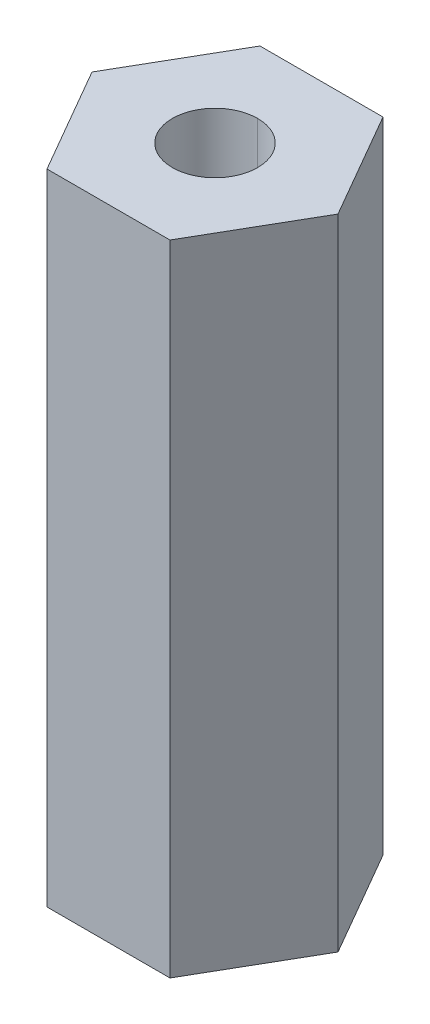
ISO-10303-21;
HEADER;
FILE_DESCRIPTION(('STEP AP214'),'2;1');
FILE_NAME('part.step','',(''),(''),'','','');
FILE_SCHEMA(('AUTOMOTIVE_DESIGN { 1 0 10303 214 1 1 1 1 }'));
ENDSEC;
DATA;
#1=APPLICATION_CONTEXT('core data for automotive mechanical design processes');
#2=APPLICATION_PROTOCOL_DEFINITION('international standard','automotive_design',2000,#1);
#3=PRODUCT_CONTEXT('',#1,'mechanical');
#4=PRODUCT('Part','Part','',(#3));
#5=PRODUCT_RELATED_PRODUCT_CATEGORY('part','',(#4));
#6=PRODUCT_DEFINITION_FORMATION('','',#4);
#7=PRODUCT_DEFINITION_CONTEXT('part definition',#1,'design');
#8=PRODUCT_DEFINITION('design','',#6,#7);
#9=PRODUCT_DEFINITION_SHAPE('','',#8);
#10=(LENGTH_UNIT() NAMED_UNIT(*) SI_UNIT(.MILLI.,.METRE.));
#11=(NAMED_UNIT(*) PLANE_ANGLE_UNIT() SI_UNIT($,.RADIAN.));
#12=(NAMED_UNIT(*) SI_UNIT($,.STERADIAN.) SOLID_ANGLE_UNIT());
#13=UNCERTAINTY_MEASURE_WITH_UNIT(LENGTH_MEASURE(1.E-05),#10,'distance_accuracy_value','');
#14=(GEOMETRIC_REPRESENTATION_CONTEXT(3) GLOBAL_UNCERTAINTY_ASSIGNED_CONTEXT((#13)) GLOBAL_UNIT_ASSIGNED_CONTEXT((#10,
#11,#12)) REPRESENTATION_CONTEXT('',''));
#15=CARTESIAN_POINT('',(0.,0.,0.));
#16=DIRECTION('',(0.,0.,1.));
#17=DIRECTION('',(1.,0.,0.));
#18=AXIS2_PLACEMENT_3D('',#15,#16,#17);
#19=CARTESIAN_POINT('',(0.,15.,0.));
#20=DIRECTION('',(0.,-1.,0.));
#21=DIRECTION('',(0.,0.,-1.));
#22=AXIS2_PLACEMENT_3D('',#19,#20,#21);
#23=CYLINDRICAL_SURFACE('',#22,1.);
#24=DIRECTION('',(0.,-1.,0.));
#25=VECTOR('',#24,1.);
#26=CARTESIAN_POINT('',(0.,7.5,-1.));
#27=LINE('',#26,#25);
#28=CARTESIAN_POINT('',(0.,15.,-1.));
#29=VERTEX_POINT('',#28);
#30=CARTESIAN_POINT('',(0.,0.,-1.));
#31=VERTEX_POINT('',#30);
#32=EDGE_CURVE('E104',#29,#31,#27,.T.);
#33=ORIENTED_EDGE('',*,*,#32,.F.);
#34=CARTESIAN_POINT('',(0.,15.,0.));
#35=DIRECTION('',(0.,-1.,0.));
#36=DIRECTION('',(0.,0.,1.));
#37=AXIS2_PLACEMENT_3D('',#34,#35,#36);
#38=CIRCLE('',#37,1.);
#39=CARTESIAN_POINT('',(0.,15.,1.));
#40=VERTEX_POINT('',#39);
#41=EDGE_CURVE('E174',#40,#29,#38,.T.);
#42=ORIENTED_EDGE('',*,*,#41,.F.);
#43=DIRECTION('',(0.,-1.,0.));
#44=VECTOR('',#43,1.);
#45=CARTESIAN_POINT('',(0.,7.5,1.));
#46=LINE('',#45,#44);
#47=CARTESIAN_POINT('',(0.,0.,1.));
#48=VERTEX_POINT('',#47);
#49=EDGE_CURVE('E107',#40,#48,#46,.T.);
#50=ORIENTED_EDGE('',*,*,#49,.T.);
#51=CARTESIAN_POINT('',(0.,0.,0.));
#52=DIRECTION('',(0.,-1.,0.));
#53=DIRECTION('',(0.,0.,1.));
#54=AXIS2_PLACEMENT_3D('',#51,#52,#53);
#55=CIRCLE('',#54,1.);
#56=EDGE_CURVE('E101',#48,#31,#55,.T.);
#57=ORIENTED_EDGE('',*,*,#56,.T.);
#58=EDGE_LOOP('',(#33,#42,#50,#57));
#59=FACE_BOUND('',#58,.T.);
#60=ADVANCED_FACE('F16',(#59),#23,.F.);
#61=CARTESIAN_POINT('',(1.43837567300093,-0.0099999999999989,2.50866025403838));
#62=DIRECTION('',(0.866025403838329,0.,0.49999999990666));
#63=DIRECTION('',(0.49999999990666,0.,-0.866025403838329));
#64=AXIS2_PLACEMENT_3D('',#61,#62,#63);
#65=PLANE('',#64);
#66=DIRECTION('',(0.500000000006738,0.,-0.866025403780548));
#67=VECTOR('',#66,1.);
#68=CARTESIAN_POINT('',(2.1650635095,0.,1.25));
#69=LINE('',#68,#67);
#70=CARTESIAN_POINT('',(1.443375673,0.,2.5));
#71=VERTEX_POINT('',#70);
#72=CARTESIAN_POINT('',(2.886751346,0.,0.));
#73=VERTEX_POINT('',#72);
#74=EDGE_CURVE('E130',#71,#73,#69,.T.);
#75=ORIENTED_EDGE('',*,*,#74,.T.);
#76=DIRECTION('',(0.,-1.,0.));
#77=VECTOR('',#76,1.);
#78=CARTESIAN_POINT('',(2.886751346,7.5,0.));
#79=LINE('',#78,#77);
#80=CARTESIAN_POINT('',(2.886751346,15.,0.));
#81=VERTEX_POINT('',#80);
#82=EDGE_CURVE('E11',#81,#73,#79,.T.);
#83=ORIENTED_EDGE('',*,*,#82,.F.);
#84=DIRECTION('',(0.500000000006738,0.,-0.866025403780548));
#85=VECTOR('',#84,1.);
#86=CARTESIAN_POINT('',(2.1650635095,15.,1.25));
#87=LINE('',#86,#85);
#88=CARTESIAN_POINT('',(1.443375673,15.,2.5));
#89=VERTEX_POINT('',#88);
#90=EDGE_CURVE('E111',#89,#81,#87,.T.);
#91=ORIENTED_EDGE('',*,*,#90,.F.);
#92=DIRECTION('',(0.,-1.,0.));
#93=VECTOR('',#92,1.);
#94=CARTESIAN_POINT('',(1.443375673,7.5,2.5));
#95=LINE('',#94,#93);
#96=EDGE_CURVE('E177',#89,#71,#95,.T.);
#97=ORIENTED_EDGE('',*,*,#96,.T.);
#98=EDGE_LOOP('',(#75,#83,#91,#97));
#99=FACE_BOUND('',#98,.T.);
#100=ADVANCED_FACE('F210',(#99),#65,.T.);
#101=CARTESIAN_POINT('',(2.89175134599907,-0.0099999999999989,0.00866025403838329));
#102=DIRECTION('',(0.866025403838329,0.,-0.49999999990666));
#103=DIRECTION('',(-0.49999999990666,0.,-0.866025403838329));
#104=AXIS2_PLACEMENT_3D('',#101,#102,#103);
#105=PLANE('',#104);
#106=DIRECTION('',(-0.500000000006738,0.,-0.866025403780548));
#107=VECTOR('',#106,1.);
#108=CARTESIAN_POINT('',(2.1650635095,0.,-1.25));
#109=LINE('',#108,#107);
#110=CARTESIAN_POINT('',(1.443375673,0.,-2.5));
#111=VERTEX_POINT('',#110);
#112=EDGE_CURVE('E112',#73,#111,#109,.T.);
#113=ORIENTED_EDGE('',*,*,#112,.T.);
#114=DIRECTION('',(0.,-1.,0.));
#115=VECTOR('',#114,1.);
#116=CARTESIAN_POINT('',(1.443375673,7.5,-2.5));
#117=LINE('',#116,#115);
#118=CARTESIAN_POINT('',(1.443375673,15.,-2.5));
#119=VERTEX_POINT('',#118);
#120=EDGE_CURVE('E27',#119,#111,#117,.T.);
#121=ORIENTED_EDGE('',*,*,#120,.F.);
#122=DIRECTION('',(-0.500000000006738,0.,-0.866025403780548));
#123=VECTOR('',#122,1.);
#124=CARTESIAN_POINT('',(2.1650635095,15.,-1.25));
#125=LINE('',#124,#123);
#126=EDGE_CURVE('E155',#81,#119,#125,.T.);
#127=ORIENTED_EDGE('',*,*,#126,.F.);
#128=ORIENTED_EDGE('',*,*,#82,.T.);
#129=EDGE_LOOP('',(#113,#121,#127,#128));
#130=FACE_BOUND('',#129,.T.);
#131=ADVANCED_FACE('F199',(#130),#105,.T.);
#132=CARTESIAN_POINT('',(1.453375673,-0.0099999999999989,-2.5));
#133=DIRECTION('',(0.,0.,-1.));
#134=DIRECTION('',(-1.,0.,0.));
#135=AXIS2_PLACEMENT_3D('',#132,#133,#134);
#136=PLANE('',#135);
#137=DIRECTION('',(-1.,0.,0.));
#138=VECTOR('',#137,1.);
#139=CARTESIAN_POINT('',(0.,0.,-2.5));
#140=LINE('',#139,#138);
#141=CARTESIAN_POINT('',(-1.443375673,0.,-2.5));
#142=VERTEX_POINT('',#141);
#143=EDGE_CURVE('E145',#111,#142,#140,.T.);
#144=ORIENTED_EDGE('',*,*,#143,.T.);
#145=DIRECTION('',(0.,-1.,0.));
#146=VECTOR('',#145,1.);
#147=CARTESIAN_POINT('',(-1.443375673,7.5,-2.5));
#148=LINE('',#147,#146);
#149=CARTESIAN_POINT('',(-1.443375673,15.,-2.5));
#150=VERTEX_POINT('',#149);
#151=EDGE_CURVE('E185',#150,#142,#148,.T.);
#152=ORIENTED_EDGE('',*,*,#151,.F.);
#153=DIRECTION('',(-1.,0.,0.));
#154=VECTOR('',#153,1.);
#155=CARTESIAN_POINT('',(0.,15.,-2.5));
#156=LINE('',#155,#154);
#157=EDGE_CURVE('E159',#119,#150,#156,.T.);
#158=ORIENTED_EDGE('',*,*,#157,.F.);
#159=ORIENTED_EDGE('',*,*,#120,.T.);
#160=EDGE_LOOP('',(#144,#152,#158,#159));
#161=FACE_BOUND('',#160,.T.);
#162=ADVANCED_FACE('F193',(#161),#136,.T.);
#163=CARTESIAN_POINT('',(-1.43837567300093,-0.0099999999999989,-2.50866025403838));
#164=DIRECTION('',(-0.866025403838329,0.,-0.49999999990666));
#165=DIRECTION('',(-0.49999999990666,0.,0.866025403838329));
#166=AXIS2_PLACEMENT_3D('',#163,#164,#165);
#167=PLANE('',#166);
#168=DIRECTION('',(-0.500000000006738,0.,0.866025403780548));
#169=VECTOR('',#168,1.);
#170=CARTESIAN_POINT('',(-2.1650635095,0.,-1.25));
#171=LINE('',#170,#169);
#172=CARTESIAN_POINT('',(-2.886751346,0.,0.));
#173=VERTEX_POINT('',#172);
#174=EDGE_CURVE('E141',#142,#173,#171,.T.);
#175=ORIENTED_EDGE('',*,*,#174,.T.);
#176=DIRECTION('',(0.,-1.,0.));
#177=VECTOR('',#176,1.);
#178=CARTESIAN_POINT('',(-2.886751346,7.5,0.));
#179=LINE('',#178,#177);
#180=CARTESIAN_POINT('',(-2.886751346,15.,0.));
#181=VERTEX_POINT('',#180);
#182=EDGE_CURVE('E182',#181,#173,#179,.T.);
#183=ORIENTED_EDGE('',*,*,#182,.F.);
#184=DIRECTION('',(-0.500000000006738,0.,0.866025403780548));
#185=VECTOR('',#184,1.);
#186=CARTESIAN_POINT('',(-2.1650635095,15.,-1.25));
#187=LINE('',#186,#185);
#188=EDGE_CURVE('E163',#150,#181,#187,.T.);
#189=ORIENTED_EDGE('',*,*,#188,.F.);
#190=ORIENTED_EDGE('',*,*,#151,.T.);
#191=EDGE_LOOP('',(#175,#183,#189,#190));
#192=FACE_BOUND('',#191,.T.);
#193=ADVANCED_FACE('F204',(#192),#167,.T.);
#194=CARTESIAN_POINT('',(-2.89175134599907,-0.0099999999999989,-0.00866025403838329));
#195=DIRECTION('',(-0.866025403838329,0.,0.49999999990666));
#196=DIRECTION('',(0.49999999990666,0.,0.866025403838329));
#197=AXIS2_PLACEMENT_3D('',#194,#195,#196);
#198=PLANE('',#197);
#199=DIRECTION('',(0.500000000006738,0.,0.866025403780548));
#200=VECTOR('',#199,1.);
#201=CARTESIAN_POINT('',(-2.1650635095,0.,1.25));
#202=LINE('',#201,#200);
#203=CARTESIAN_POINT('',(-1.443375673,0.,2.5));
#204=VERTEX_POINT('',#203);
#205=EDGE_CURVE('E138',#173,#204,#202,.T.);
#206=ORIENTED_EDGE('',*,*,#205,.T.);
#207=DIRECTION('',(0.,-1.,0.));
#208=VECTOR('',#207,1.);
#209=CARTESIAN_POINT('',(-1.443375673,7.5,2.5));
#210=LINE('',#209,#208);
#211=CARTESIAN_POINT('',(-1.443375673,15.,2.5));
#212=VERTEX_POINT('',#211);
#213=EDGE_CURVE('E41',#212,#204,#210,.T.);
#214=ORIENTED_EDGE('',*,*,#213,.F.);
#215=DIRECTION('',(0.500000000006738,0.,0.866025403780548));
#216=VECTOR('',#215,1.);
#217=CARTESIAN_POINT('',(-2.1650635095,15.,1.25));
#218=LINE('',#217,#216);
#219=EDGE_CURVE('E167',#181,#212,#218,.T.);
#220=ORIENTED_EDGE('',*,*,#219,.F.);
#221=ORIENTED_EDGE('',*,*,#182,.T.);
#222=EDGE_LOOP('',(#206,#214,#220,#221));
#223=FACE_BOUND('',#222,.T.);
#224=ADVANCED_FACE('F213',(#223),#198,.T.);
#225=CARTESIAN_POINT('',(-1.453375673,-0.0099999999999989,2.5));
#226=DIRECTION('',(0.,0.,1.));
#227=DIRECTION('',(1.,0.,0.));
#228=AXIS2_PLACEMENT_3D('',#225,#226,#227);
#229=PLANE('',#228);
#230=DIRECTION('',(1.,0.,0.));
#231=VECTOR('',#230,1.);
#232=CARTESIAN_POINT('',(0.,0.,2.5));
#233=LINE('',#232,#231);
#234=EDGE_CURVE('E134',#204,#71,#233,.T.);
#235=ORIENTED_EDGE('',*,*,#234,.T.);
#236=ORIENTED_EDGE('',*,*,#96,.F.);
#237=DIRECTION('',(1.,0.,0.));
#238=VECTOR('',#237,1.);
#239=CARTESIAN_POINT('',(0.,15.,2.5));
#240=LINE('',#239,#238);
#241=EDGE_CURVE('E171',#212,#89,#240,.T.);
#242=ORIENTED_EDGE('',*,*,#241,.F.);
#243=ORIENTED_EDGE('',*,*,#213,.T.);
#244=EDGE_LOOP('',(#235,#236,#242,#243));
#245=FACE_BOUND('',#244,.T.);
#246=ADVANCED_FACE('F212',(#245),#229,.T.);
#247=CARTESIAN_POINT('',(-2.896751346,15.,-2.51));
#248=DIRECTION('',(0.,1.,0.));
#249=DIRECTION('',(0.,0.,1.));
#250=AXIS2_PLACEMENT_3D('',#247,#248,#249);
#251=PLANE('',#250);
#252=CARTESIAN_POINT('',(0.,15.,0.));
#253=DIRECTION('',(0.,-1.,0.));
#254=DIRECTION('',(0.,0.,-1.));
#255=AXIS2_PLACEMENT_3D('',#252,#253,#254);
#256=CIRCLE('',#255,1.);
#257=EDGE_CURVE('E20',#29,#40,#256,.T.);
#258=ORIENTED_EDGE('',*,*,#257,.T.);
#259=ORIENTED_EDGE('',*,*,#41,.T.);
#260=EDGE_LOOP('',(#258,#259));
#261=FACE_BOUND('',#260,.T.);
#262=ORIENTED_EDGE('',*,*,#90,.T.);
#263=ORIENTED_EDGE('',*,*,#126,.T.);
#264=ORIENTED_EDGE('',*,*,#157,.T.);
#265=ORIENTED_EDGE('',*,*,#188,.T.);
#266=ORIENTED_EDGE('',*,*,#219,.T.);
#267=ORIENTED_EDGE('',*,*,#241,.T.);
#268=EDGE_LOOP('',(#262,#263,#264,#265,#266,#267));
#269=FACE_BOUND('',#268,.T.);
#270=ADVANCED_FACE('F207',(#261,#269),#251,.T.);
#271=CARTESIAN_POINT('',(-2.896751346,0.,2.51));
#272=DIRECTION('',(0.,-1.,0.));
#273=DIRECTION('',(0.,0.,-1.));
#274=AXIS2_PLACEMENT_3D('',#271,#272,#273);
#275=PLANE('',#274);
#276=CARTESIAN_POINT('',(0.,0.,0.));
#277=DIRECTION('',(0.,-1.,0.));
#278=DIRECTION('',(0.,0.,-1.));
#279=AXIS2_PLACEMENT_3D('',#276,#277,#278);
#280=CIRCLE('',#279,1.);
#281=EDGE_CURVE('E114',#31,#48,#280,.T.);
#282=ORIENTED_EDGE('',*,*,#281,.F.);
#283=ORIENTED_EDGE('',*,*,#56,.F.);
#284=EDGE_LOOP('',(#282,#283));
#285=FACE_BOUND('',#284,.T.);
#286=ORIENTED_EDGE('',*,*,#74,.F.);
#287=ORIENTED_EDGE('',*,*,#234,.F.);
#288=ORIENTED_EDGE('',*,*,#205,.F.);
#289=ORIENTED_EDGE('',*,*,#174,.F.);
#290=ORIENTED_EDGE('',*,*,#143,.F.);
#291=ORIENTED_EDGE('',*,*,#112,.F.);
#292=EDGE_LOOP('',(#286,#287,#288,#289,#290,#291));
#293=FACE_BOUND('',#292,.T.);
#294=ADVANCED_FACE('F115',(#285,#293),#275,.T.);
#295=CARTESIAN_POINT('',(0.,15.,0.));
#296=DIRECTION('',(0.,-1.,0.));
#297=DIRECTION('',(0.,0.,-1.));
#298=AXIS2_PLACEMENT_3D('',#295,#296,#297);
#299=CYLINDRICAL_SURFACE('',#298,1.);
#300=ORIENTED_EDGE('',*,*,#257,.F.);
#301=ORIENTED_EDGE('',*,*,#32,.T.);
#302=ORIENTED_EDGE('',*,*,#281,.T.);
#303=ORIENTED_EDGE('',*,*,#49,.F.);
#304=EDGE_LOOP('',(#300,#301,#302,#303));
#305=FACE_BOUND('',#304,.T.);
#306=ADVANCED_FACE('F18',(#305),#299,.F.);
#307=CLOSED_SHELL('',(#60,#100,#131,#162,#193,#224,#246,#270,#294,#306));
#308=MANIFOLD_SOLID_BREP('B1',#307);
#309=ADVANCED_BREP_SHAPE_REPRESENTATION('',(#18,#308),#14);
#310=SHAPE_DEFINITION_REPRESENTATION(#9,#309);
ENDSEC;
END-ISO-10303-21;
